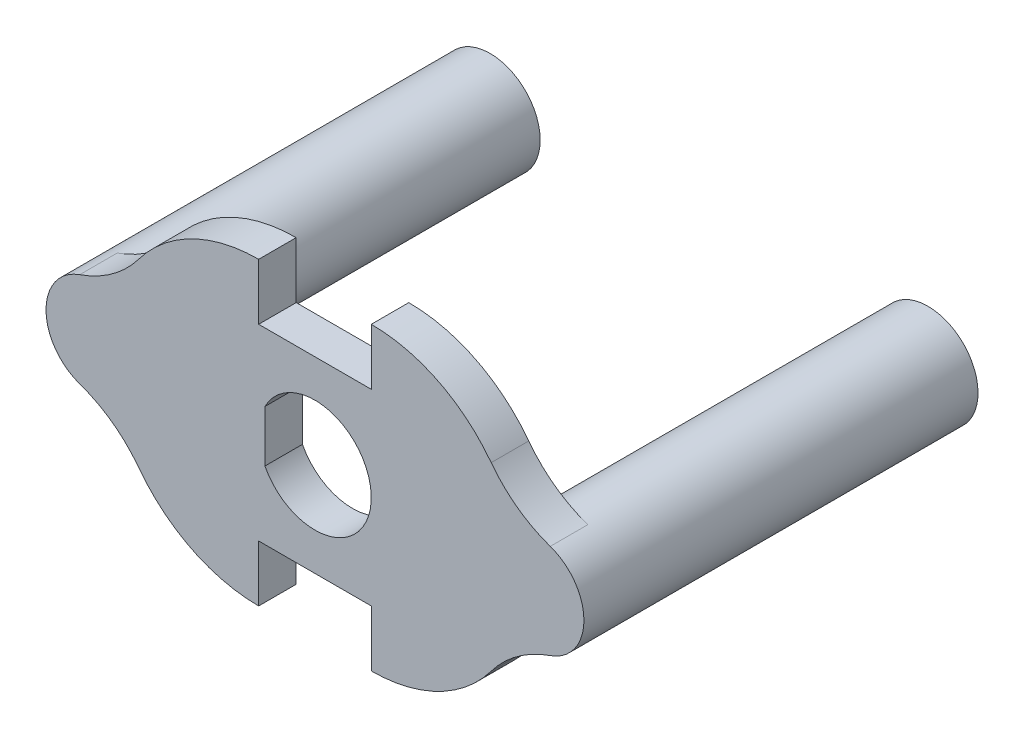
ISO-10303-21;
HEADER;
FILE_DESCRIPTION(('STEP AP214'),'2;1');
FILE_NAME('part.step','',(''),(''),'','','');
FILE_SCHEMA(('AUTOMOTIVE_DESIGN { 1 0 10303 214 1 1 1 1 }'));
ENDSEC;
DATA;
#1=APPLICATION_CONTEXT('core data for automotive mechanical design processes');
#2=APPLICATION_PROTOCOL_DEFINITION('international standard','automotive_design',2000,#1);
#3=PRODUCT_CONTEXT('',#1,'mechanical');
#4=PRODUCT('Part','Part','',(#3));
#5=PRODUCT_RELATED_PRODUCT_CATEGORY('part','',(#4));
#6=PRODUCT_DEFINITION_FORMATION('','',#4);
#7=PRODUCT_DEFINITION_CONTEXT('part definition',#1,'design');
#8=PRODUCT_DEFINITION('design','',#6,#7);
#9=PRODUCT_DEFINITION_SHAPE('','',#8);
#10=(LENGTH_UNIT() NAMED_UNIT(*) SI_UNIT(.MILLI.,.METRE.));
#11=(NAMED_UNIT(*) PLANE_ANGLE_UNIT() SI_UNIT($,.RADIAN.));
#12=(NAMED_UNIT(*) SI_UNIT($,.STERADIAN.) SOLID_ANGLE_UNIT());
#13=UNCERTAINTY_MEASURE_WITH_UNIT(LENGTH_MEASURE(1.E-05),#10,'distance_accuracy_value','');
#14=(GEOMETRIC_REPRESENTATION_CONTEXT(3) GLOBAL_UNCERTAINTY_ASSIGNED_CONTEXT((#13)) GLOBAL_UNIT_ASSIGNED_CONTEXT((#10,
#11,#12)) REPRESENTATION_CONTEXT('',''));
#15=CARTESIAN_POINT('',(0.,0.,0.));
#16=DIRECTION('',(0.,0.,1.));
#17=DIRECTION('',(1.,0.,0.));
#18=AXIS2_PLACEMENT_3D('',#15,#16,#17);
#19=CARTESIAN_POINT('',(-17.5,0.,-1.5));
#20=DIRECTION('',(0.,0.,1.));
#21=DIRECTION('',(1.,0.,0.));
#22=AXIS2_PLACEMENT_3D('',#19,#20,#21);
#23=CYLINDRICAL_SURFACE('',#22,4.);
#24=CARTESIAN_POINT('',(-17.5,0.,1.5));
#25=DIRECTION('',(0.,0.,1.));
#26=DIRECTION('',(-1.,0.,0.));
#27=AXIS2_PLACEMENT_3D('',#24,#25,#26);
#28=CIRCLE('',#27,4.);
#29=CARTESIAN_POINT('',(-18.8076923076923,3.78020380778634,1.5));
#30=VERTEX_POINT('',#29);
#31=CARTESIAN_POINT('',(-18.8076923076923,-3.78020380778634,1.5));
#32=VERTEX_POINT('',#31);
#33=EDGE_CURVE('E324',#30,#32,#28,.T.);
#34=ORIENTED_EDGE('',*,*,#33,.F.);
#35=DIRECTION('',(0.,0.,1.));
#36=VECTOR('',#35,1.);
#37=CARTESIAN_POINT('',(-18.8076923076923,3.78020380778634,-1.5));
#38=LINE('',#37,#36);
#39=CARTESIAN_POINT('',(-18.8076923076923,3.78020380778635,-1.5));
#40=VERTEX_POINT('',#39);
#41=EDGE_CURVE('E399',#40,#30,#38,.T.);
#42=ORIENTED_EDGE('',*,*,#41,.F.);
#43=CARTESIAN_POINT('',(-17.5,0.,-1.5));
#44=DIRECTION('',(0.,0.,-1.));
#45=DIRECTION('',(-1.,0.,0.));
#46=AXIS2_PLACEMENT_3D('',#43,#44,#45);
#47=CIRCLE('',#46,4.);
#48=CARTESIAN_POINT('',(-18.8076923076923,-3.78020380778634,-1.5));
#49=VERTEX_POINT('',#48);
#50=EDGE_CURVE('E11',#40,#49,#47,.T.);
#51=ORIENTED_EDGE('',*,*,#50,.T.);
#52=DIRECTION('',(0.,0.,1.));
#53=VECTOR('',#52,1.);
#54=CARTESIAN_POINT('',(-18.8076923076923,-3.78020380778634,-1.5));
#55=LINE('',#54,#53);
#56=EDGE_CURVE('E396',#49,#32,#55,.T.);
#57=ORIENTED_EDGE('',*,*,#56,.T.);
#58=EDGE_LOOP('',(#34,#42,#51,#57));
#59=FACE_BOUND('',#58,.T.);
#60=CARTESIAN_POINT('',(-17.5,0.,-30.));
#61=DIRECTION('',(0.,0.,1.));
#62=DIRECTION('',(1.,0.,0.));
#63=AXIS2_PLACEMENT_3D('',#60,#61,#62);
#64=CIRCLE('',#63,4.);
#65=CARTESIAN_POINT('',(-13.5,0.,-30.));
#66=VERTEX_POINT('',#65);
#67=EDGE_CURVE('E203',#66,#66,#64,.T.);
#68=ORIENTED_EDGE('',*,*,#67,.T.);
#69=EDGE_LOOP('',(#68));
#70=FACE_BOUND('',#69,.T.);
#71=DIRECTION('',(0.,0.,-1.));
#72=VECTOR('',#71,1.);
#73=CARTESIAN_POINT('',(-20.1457513110646,3.,-12.5));
#74=LINE('',#73,#72);
#75=CARTESIAN_POINT('',(-20.1457513110646,3.,-12.5));
#76=VERTEX_POINT('',#75);
#77=CARTESIAN_POINT('',(-20.1457513110646,3.,-18.5));
#78=VERTEX_POINT('',#77);
#79=EDGE_CURVE('E186',#76,#78,#74,.T.);
#80=ORIENTED_EDGE('',*,*,#79,.F.);
#81=CARTESIAN_POINT('',(-17.5,0.,-12.5));
#82=DIRECTION('',(0.,0.,-1.));
#83=DIRECTION('',(-1.,0.,0.));
#84=AXIS2_PLACEMENT_3D('',#81,#82,#83);
#85=CIRCLE('',#84,4.);
#86=CARTESIAN_POINT('',(-20.1457513110646,-3.,-12.5));
#87=VERTEX_POINT('',#86);
#88=EDGE_CURVE('E175',#87,#76,#85,.T.);
#89=ORIENTED_EDGE('',*,*,#88,.F.);
#90=DIRECTION('',(0.,0.,-1.));
#91=VECTOR('',#90,1.);
#92=CARTESIAN_POINT('',(-20.1457513110646,-3.,-12.5));
#93=LINE('',#92,#91);
#94=CARTESIAN_POINT('',(-20.1457513110646,-3.,-18.5));
#95=VERTEX_POINT('',#94);
#96=EDGE_CURVE('E188',#87,#95,#93,.T.);
#97=ORIENTED_EDGE('',*,*,#96,.T.);
#98=CARTESIAN_POINT('',(-17.5,0.,-18.5));
#99=DIRECTION('',(0.,0.,-1.));
#100=DIRECTION('',(-1.,0.,0.));
#101=AXIS2_PLACEMENT_3D('',#98,#99,#100);
#102=CIRCLE('',#101,4.);
#103=EDGE_CURVE('E191',#95,#78,#102,.T.);
#104=ORIENTED_EDGE('',*,*,#103,.T.);
#105=EDGE_LOOP('',(#80,#89,#97,#104));
#106=FACE_BOUND('',#105,.T.);
#107=ADVANCED_FACE('F38',(#59,#70,#106),#23,.T.);
#108=CARTESIAN_POINT('',(4.5,7.5,-1.5));
#109=DIRECTION('',(-1.,0.,0.));
#110=DIRECTION('',(0.,0.,1.));
#111=AXIS2_PLACEMENT_3D('',#108,#109,#110);
#112=PLANE('',#111);
#113=DIRECTION('',(0.,-1.,0.));
#114=VECTOR('',#113,1.);
#115=CARTESIAN_POINT('',(4.5,7.5,1.5));
#116=LINE('',#115,#114);
#117=CARTESIAN_POINT('',(4.5,12.,1.5));
#118=VERTEX_POINT('',#117);
#119=CARTESIAN_POINT('',(4.5,7.5,1.5));
#120=VERTEX_POINT('',#119);
#121=EDGE_CURVE('E243',#118,#120,#116,.T.);
#122=ORIENTED_EDGE('',*,*,#121,.F.);
#123=DIRECTION('',(0.,0.,1.));
#124=VECTOR('',#123,1.);
#125=CARTESIAN_POINT('',(4.5,12.,-1.5));
#126=LINE('',#125,#124);
#127=CARTESIAN_POINT('',(4.5,12.,-1.5));
#128=VERTEX_POINT('',#127);
#129=EDGE_CURVE('E226',#128,#118,#126,.T.);
#130=ORIENTED_EDGE('',*,*,#129,.F.);
#131=DIRECTION('',(0.,-1.,0.));
#132=VECTOR('',#131,1.);
#133=CARTESIAN_POINT('',(4.5,7.5,-1.5));
#134=LINE('',#133,#132);
#135=CARTESIAN_POINT('',(4.5,7.5,-1.5));
#136=VERTEX_POINT('',#135);
#137=EDGE_CURVE('E247',#128,#136,#134,.T.);
#138=ORIENTED_EDGE('',*,*,#137,.T.);
#139=DIRECTION('',(0.,0.,1.));
#140=VECTOR('',#139,1.);
#141=CARTESIAN_POINT('',(4.5,7.5,-1.5));
#142=LINE('',#141,#140);
#143=EDGE_CURVE('E304',#136,#120,#142,.T.);
#144=ORIENTED_EDGE('',*,*,#143,.T.);
#145=EDGE_LOOP('',(#122,#130,#138,#144));
#146=FACE_BOUND('',#145,.T.);
#147=ADVANCED_FACE('F40',(#146),#112,.T.);
#148=CARTESIAN_POINT('',(4.5,0.,-1.5));
#149=DIRECTION('',(0.,0.,1.));
#150=DIRECTION('',(1.,0.,0.));
#151=AXIS2_PLACEMENT_3D('',#148,#149,#150);
#152=CYLINDRICAL_SURFACE('',#151,12.);
#153=CARTESIAN_POINT('',(4.5,0.,1.5));
#154=DIRECTION('',(0.,0.,1.));
#155=DIRECTION('',(-1.,0.,0.));
#156=AXIS2_PLACEMENT_3D('',#153,#154,#155);
#157=CIRCLE('',#156,12.);
#158=CARTESIAN_POINT('',(14.0874125874126,7.21675272395575,1.5));
#159=VERTEX_POINT('',#158);
#160=EDGE_CURVE('E252',#159,#118,#157,.T.);
#161=ORIENTED_EDGE('',*,*,#160,.F.);
#162=DIRECTION('',(0.,0.,1.));
#163=VECTOR('',#162,1.);
#164=CARTESIAN_POINT('',(14.0874125874126,7.21675272395575,-1.5));
#165=LINE('',#164,#163);
#166=CARTESIAN_POINT('',(14.0874125874126,7.21675272395575,-1.5));
#167=VERTEX_POINT('',#166);
#168=EDGE_CURVE('E369',#167,#159,#165,.T.);
#169=ORIENTED_EDGE('',*,*,#168,.F.);
#170=CARTESIAN_POINT('',(4.5,0.,-1.5));
#171=DIRECTION('',(0.,0.,1.));
#172=DIRECTION('',(-1.,0.,0.));
#173=AXIS2_PLACEMENT_3D('',#170,#171,#172);
#174=CIRCLE('',#173,12.);
#175=EDGE_CURVE('E300',#167,#128,#174,.T.);
#176=ORIENTED_EDGE('',*,*,#175,.T.);
#177=ORIENTED_EDGE('',*,*,#129,.T.);
#178=EDGE_LOOP('',(#161,#169,#176,#177));
#179=FACE_BOUND('',#178,.T.);
#180=ADVANCED_FACE('F424',(#179),#152,.T.);
#181=CARTESIAN_POINT('',(22.0769230769231,13.2307133272522,-1.5));
#182=DIRECTION('',(0.,0.,1.));
#183=DIRECTION('',(1.,0.,0.));
#184=AXIS2_PLACEMENT_3D('',#181,#182,#183);
#185=CYLINDRICAL_SURFACE('',#184,10.);
#186=CARTESIAN_POINT('',(22.0769230769231,13.2307133272522,1.5));
#187=DIRECTION('',(0.,0.,-1.));
#188=DIRECTION('',(1.,0.,0.));
#189=AXIS2_PLACEMENT_3D('',#186,#187,#188);
#190=CIRCLE('',#189,10.);
#191=CARTESIAN_POINT('',(18.8076923076923,3.78020380778634,1.5));
#192=VERTEX_POINT('',#191);
#193=EDGE_CURVE('E360',#192,#159,#190,.T.);
#194=ORIENTED_EDGE('',*,*,#193,.F.);
#195=DIRECTION('',(0.,0.,1.));
#196=VECTOR('',#195,1.);
#197=CARTESIAN_POINT('',(18.8076923076923,3.78020380778634,-1.5));
#198=LINE('',#197,#196);
#199=CARTESIAN_POINT('',(18.8076923076923,3.78020380778634,-1.5));
#200=VERTEX_POINT('',#199);
#201=EDGE_CURVE('E372',#200,#192,#198,.T.);
#202=ORIENTED_EDGE('',*,*,#201,.F.);
#203=CARTESIAN_POINT('',(22.0769230769231,13.2307133272522,-1.5));
#204=DIRECTION('',(0.,0.,-1.));
#205=DIRECTION('',(1.,0.,0.));
#206=AXIS2_PLACEMENT_3D('',#203,#204,#205);
#207=CIRCLE('',#206,10.);
#208=EDGE_CURVE('E296',#200,#167,#207,.T.);
#209=ORIENTED_EDGE('',*,*,#208,.T.);
#210=ORIENTED_EDGE('',*,*,#168,.T.);
#211=EDGE_LOOP('',(#194,#202,#209,#210));
#212=FACE_BOUND('',#211,.T.);
#213=ADVANCED_FACE('F480',(#212),#185,.F.);
#214=CARTESIAN_POINT('',(17.5,0.,-1.5));
#215=DIRECTION('',(0.,0.,1.));
#216=DIRECTION('',(1.,0.,0.));
#217=AXIS2_PLACEMENT_3D('',#214,#215,#216);
#218=CYLINDRICAL_SURFACE('',#217,4.);
#219=CARTESIAN_POINT('',(17.5,0.,1.5));
#220=DIRECTION('',(0.,0.,1.));
#221=DIRECTION('',(1.,0.,0.));
#222=AXIS2_PLACEMENT_3D('',#219,#220,#221);
#223=CIRCLE('',#222,4.);
#224=CARTESIAN_POINT('',(18.8076923076923,-3.78020380778635,1.5));
#225=VERTEX_POINT('',#224);
#226=EDGE_CURVE('E356',#225,#192,#223,.T.);
#227=ORIENTED_EDGE('',*,*,#226,.F.);
#228=DIRECTION('',(0.,0.,1.));
#229=VECTOR('',#228,1.);
#230=CARTESIAN_POINT('',(18.8076923076923,-3.78020380778635,-1.5));
#231=LINE('',#230,#229);
#232=CARTESIAN_POINT('',(18.8076923076923,-3.78020380778635,-1.5));
#233=VERTEX_POINT('',#232);
#234=EDGE_CURVE('E375',#233,#225,#231,.T.);
#235=ORIENTED_EDGE('',*,*,#234,.F.);
#236=CARTESIAN_POINT('',(17.5,0.,-1.5));
#237=DIRECTION('',(0.,0.,-1.));
#238=DIRECTION('',(-1.,0.,0.));
#239=AXIS2_PLACEMENT_3D('',#236,#237,#238);
#240=CIRCLE('',#239,4.);
#241=EDGE_CURVE('E47',#233,#200,#240,.T.);
#242=ORIENTED_EDGE('',*,*,#241,.T.);
#243=ORIENTED_EDGE('',*,*,#201,.T.);
#244=EDGE_LOOP('',(#227,#235,#242,#243));
#245=FACE_BOUND('',#244,.T.);
#246=CARTESIAN_POINT('',(17.5,0.,-30.));
#247=DIRECTION('',(0.,0.,-1.));
#248=DIRECTION('',(-1.,0.,0.));
#249=AXIS2_PLACEMENT_3D('',#246,#247,#248);
#250=CIRCLE('',#249,4.);
#251=CARTESIAN_POINT('',(13.5,0.,-30.));
#252=VERTEX_POINT('',#251);
#253=EDGE_CURVE('E215',#252,#252,#250,.T.);
#254=ORIENTED_EDGE('',*,*,#253,.F.);
#255=EDGE_LOOP('',(#254));
#256=FACE_BOUND('',#255,.T.);
#257=ADVANCED_FACE('F476',(#245,#256),#218,.T.);
#258=CARTESIAN_POINT('',(22.0769230769231,-13.2307133272522,-1.5));
#259=DIRECTION('',(0.,0.,1.));
#260=DIRECTION('',(1.,0.,0.));
#261=AXIS2_PLACEMENT_3D('',#258,#259,#260);
#262=CYLINDRICAL_SURFACE('',#261,10.);
#263=CARTESIAN_POINT('',(22.0769230769231,-13.2307133272522,1.5));
#264=DIRECTION('',(0.,0.,-1.));
#265=DIRECTION('',(-1.,0.,0.));
#266=AXIS2_PLACEMENT_3D('',#263,#264,#265);
#267=CIRCLE('',#266,10.);
#268=CARTESIAN_POINT('',(14.0874125874126,-7.21675272395575,1.5));
#269=VERTEX_POINT('',#268);
#270=EDGE_CURVE('E352',#269,#225,#267,.T.);
#271=ORIENTED_EDGE('',*,*,#270,.F.);
#272=DIRECTION('',(0.,0.,1.));
#273=VECTOR('',#272,1.);
#274=CARTESIAN_POINT('',(14.0874125874126,-7.21675272395575,-1.5));
#275=LINE('',#274,#273);
#276=CARTESIAN_POINT('',(14.0874125874126,-7.21675272395575,-1.5));
#277=VERTEX_POINT('',#276);
#278=EDGE_CURVE('E378',#277,#269,#275,.T.);
#279=ORIENTED_EDGE('',*,*,#278,.F.);
#280=CARTESIAN_POINT('',(22.0769230769231,-13.2307133272522,-1.5));
#281=DIRECTION('',(0.,0.,-1.));
#282=DIRECTION('',(-1.,0.,0.));
#283=AXIS2_PLACEMENT_3D('',#280,#281,#282);
#284=CIRCLE('',#283,10.);
#285=EDGE_CURVE('E292',#277,#233,#284,.T.);
#286=ORIENTED_EDGE('',*,*,#285,.T.);
#287=ORIENTED_EDGE('',*,*,#234,.T.);
#288=EDGE_LOOP('',(#271,#279,#286,#287));
#289=FACE_BOUND('',#288,.T.);
#290=ADVANCED_FACE('F472',(#289),#262,.F.);
#291=CARTESIAN_POINT('',(4.5,0.,-1.5));
#292=DIRECTION('',(0.,0.,1.));
#293=DIRECTION('',(1.,0.,0.));
#294=AXIS2_PLACEMENT_3D('',#291,#292,#293);
#295=CYLINDRICAL_SURFACE('',#294,12.);
#296=CARTESIAN_POINT('',(4.5,0.,1.5));
#297=DIRECTION('',(0.,0.,1.));
#298=DIRECTION('',(1.,0.,0.));
#299=AXIS2_PLACEMENT_3D('',#296,#297,#298);
#300=CIRCLE('',#299,12.);
#301=CARTESIAN_POINT('',(4.5,-12.,1.5));
#302=VERTEX_POINT('',#301);
#303=EDGE_CURVE('E348',#302,#269,#300,.T.);
#304=ORIENTED_EDGE('',*,*,#303,.F.);
#305=DIRECTION('',(0.,0.,1.));
#306=VECTOR('',#305,1.);
#307=CARTESIAN_POINT('',(4.5,-12.,-1.5));
#308=LINE('',#307,#306);
#309=CARTESIAN_POINT('',(4.5,-12.,-1.5));
#310=VERTEX_POINT('',#309);
#311=EDGE_CURVE('E381',#310,#302,#308,.T.);
#312=ORIENTED_EDGE('',*,*,#311,.F.);
#313=CARTESIAN_POINT('',(4.5,0.,-1.5));
#314=DIRECTION('',(0.,0.,1.));
#315=DIRECTION('',(1.,0.,0.));
#316=AXIS2_PLACEMENT_3D('',#313,#314,#315);
#317=CIRCLE('',#316,12.);
#318=EDGE_CURVE('E288',#310,#277,#317,.T.);
#319=ORIENTED_EDGE('',*,*,#318,.T.);
#320=ORIENTED_EDGE('',*,*,#278,.T.);
#321=EDGE_LOOP('',(#304,#312,#319,#320));
#322=FACE_BOUND('',#321,.T.);
#323=ADVANCED_FACE('F468',(#322),#295,.T.);
#324=CARTESIAN_POINT('',(4.5,-7.5,-1.5));
#325=DIRECTION('',(-1.,0.,0.));
#326=DIRECTION('',(0.,0.,1.));
#327=AXIS2_PLACEMENT_3D('',#324,#325,#326);
#328=PLANE('',#327);
#329=DIRECTION('',(0.,-1.,0.));
#330=VECTOR('',#329,1.);
#331=CARTESIAN_POINT('',(4.5,-7.5,1.5));
#332=LINE('',#331,#330);
#333=CARTESIAN_POINT('',(4.5,-7.5,1.5));
#334=VERTEX_POINT('',#333);
#335=EDGE_CURVE('E344',#334,#302,#332,.T.);
#336=ORIENTED_EDGE('',*,*,#335,.F.);
#337=DIRECTION('',(0.,0.,1.));
#338=VECTOR('',#337,1.);
#339=CARTESIAN_POINT('',(4.5,-7.5,-1.5));
#340=LINE('',#339,#338);
#341=CARTESIAN_POINT('',(4.5,-7.5,-1.5));
#342=VERTEX_POINT('',#341);
#343=EDGE_CURVE('E384',#342,#334,#340,.T.);
#344=ORIENTED_EDGE('',*,*,#343,.F.);
#345=DIRECTION('',(0.,-1.,0.));
#346=VECTOR('',#345,1.);
#347=CARTESIAN_POINT('',(4.5,-7.5,-1.5));
#348=LINE('',#347,#346);
#349=EDGE_CURVE('E284',#342,#310,#348,.T.);
#350=ORIENTED_EDGE('',*,*,#349,.T.);
#351=ORIENTED_EDGE('',*,*,#311,.T.);
#352=EDGE_LOOP('',(#336,#344,#350,#351));
#353=FACE_BOUND('',#352,.T.);
#354=ADVANCED_FACE('F464',(#353),#328,.T.);
#355=CARTESIAN_POINT('',(-4.5,-7.5,-1.5));
#356=DIRECTION('',(0.,-1.,0.));
#357=DIRECTION('',(0.,0.,-1.));
#358=AXIS2_PLACEMENT_3D('',#355,#356,#357);
#359=PLANE('',#358);
#360=DIRECTION('',(1.,0.,0.));
#361=VECTOR('',#360,1.);
#362=CARTESIAN_POINT('',(-4.5,-7.5,1.5));
#363=LINE('',#362,#361);
#364=CARTESIAN_POINT('',(-4.5,-7.5,1.5));
#365=VERTEX_POINT('',#364);
#366=EDGE_CURVE('E340',#365,#334,#363,.T.);
#367=ORIENTED_EDGE('',*,*,#366,.F.);
#368=DIRECTION('',(0.,0.,1.));
#369=VECTOR('',#368,1.);
#370=CARTESIAN_POINT('',(-4.5,-7.5,-1.5));
#371=LINE('',#370,#369);
#372=CARTESIAN_POINT('',(-4.5,-7.5,-1.5));
#373=VERTEX_POINT('',#372);
#374=EDGE_CURVE('E387',#373,#365,#371,.T.);
#375=ORIENTED_EDGE('',*,*,#374,.F.);
#376=DIRECTION('',(1.,0.,0.));
#377=VECTOR('',#376,1.);
#378=CARTESIAN_POINT('',(-4.5,-7.5,-1.5));
#379=LINE('',#378,#377);
#380=EDGE_CURVE('E280',#373,#342,#379,.T.);
#381=ORIENTED_EDGE('',*,*,#380,.T.);
#382=ORIENTED_EDGE('',*,*,#343,.T.);
#383=EDGE_LOOP('',(#367,#375,#381,#382));
#384=FACE_BOUND('',#383,.T.);
#385=ADVANCED_FACE('F460',(#384),#359,.T.);
#386=CARTESIAN_POINT('',(-4.5,-7.5,-1.5));
#387=DIRECTION('',(1.,0.,0.));
#388=DIRECTION('',(0.,0.,-1.));
#389=AXIS2_PLACEMENT_3D('',#386,#387,#388);
#390=PLANE('',#389);
#391=DIRECTION('',(0.,1.,0.));
#392=VECTOR('',#391,1.);
#393=CARTESIAN_POINT('',(-4.5,-7.5,1.5));
#394=LINE('',#393,#392);
#395=CARTESIAN_POINT('',(-4.5,-12.,1.5));
#396=VERTEX_POINT('',#395);
#397=EDGE_CURVE('E336',#396,#365,#394,.T.);
#398=ORIENTED_EDGE('',*,*,#397,.F.);
#399=DIRECTION('',(0.,0.,1.));
#400=VECTOR('',#399,1.);
#401=CARTESIAN_POINT('',(-4.5,-12.,-1.5));
#402=LINE('',#401,#400);
#403=CARTESIAN_POINT('',(-4.5,-12.,-1.5));
#404=VERTEX_POINT('',#403);
#405=EDGE_CURVE('E390',#404,#396,#402,.T.);
#406=ORIENTED_EDGE('',*,*,#405,.F.);
#407=DIRECTION('',(0.,1.,0.));
#408=VECTOR('',#407,1.);
#409=CARTESIAN_POINT('',(-4.5,-7.5,-1.5));
#410=LINE('',#409,#408);
#411=EDGE_CURVE('E276',#404,#373,#410,.T.);
#412=ORIENTED_EDGE('',*,*,#411,.T.);
#413=ORIENTED_EDGE('',*,*,#374,.T.);
#414=EDGE_LOOP('',(#398,#406,#412,#413));
#415=FACE_BOUND('',#414,.T.);
#416=ADVANCED_FACE('F456',(#415),#390,.T.);
#417=CARTESIAN_POINT('',(-4.5,0.,-1.5));
#418=DIRECTION('',(0.,0.,1.));
#419=DIRECTION('',(1.,0.,0.));
#420=AXIS2_PLACEMENT_3D('',#417,#418,#419);
#421=CYLINDRICAL_SURFACE('',#420,12.);
#422=CARTESIAN_POINT('',(-4.5,0.,1.5));
#423=DIRECTION('',(0.,0.,1.));
#424=DIRECTION('',(-1.,0.,0.));
#425=AXIS2_PLACEMENT_3D('',#422,#423,#424);
#426=CIRCLE('',#425,12.);
#427=CARTESIAN_POINT('',(-14.0874125874126,-7.21675272395575,1.5));
#428=VERTEX_POINT('',#427);
#429=EDGE_CURVE('E332',#428,#396,#426,.T.);
#430=ORIENTED_EDGE('',*,*,#429,.F.);
#431=DIRECTION('',(0.,0.,1.));
#432=VECTOR('',#431,1.);
#433=CARTESIAN_POINT('',(-14.0874125874126,-7.21675272395575,-1.5));
#434=LINE('',#433,#432);
#435=CARTESIAN_POINT('',(-14.0874125874126,-7.21675272395575,-1.5));
#436=VERTEX_POINT('',#435);
#437=EDGE_CURVE('E393',#436,#428,#434,.T.);
#438=ORIENTED_EDGE('',*,*,#437,.F.);
#439=CARTESIAN_POINT('',(-4.5,0.,-1.5));
#440=DIRECTION('',(0.,0.,1.));
#441=DIRECTION('',(-1.,0.,0.));
#442=AXIS2_PLACEMENT_3D('',#439,#440,#441);
#443=CIRCLE('',#442,12.);
#444=EDGE_CURVE('E272',#436,#404,#443,.T.);
#445=ORIENTED_EDGE('',*,*,#444,.T.);
#446=ORIENTED_EDGE('',*,*,#405,.T.);
#447=EDGE_LOOP('',(#430,#438,#445,#446));
#448=FACE_BOUND('',#447,.T.);
#449=ADVANCED_FACE('F452',(#448),#421,.T.);
#450=CARTESIAN_POINT('',(-22.0769230769231,-13.2307133272522,-1.5));
#451=DIRECTION('',(0.,0.,1.));
#452=DIRECTION('',(1.,0.,0.));
#453=AXIS2_PLACEMENT_3D('',#450,#451,#452);
#454=CYLINDRICAL_SURFACE('',#453,10.);
#455=CARTESIAN_POINT('',(-22.0769230769231,-13.2307133272522,1.5));
#456=DIRECTION('',(0.,0.,-1.));
#457=DIRECTION('',(1.,0.,0.));
#458=AXIS2_PLACEMENT_3D('',#455,#456,#457);
#459=CIRCLE('',#458,10.);
#460=EDGE_CURVE('E328',#32,#428,#459,.T.);
#461=ORIENTED_EDGE('',*,*,#460,.F.);
#462=ORIENTED_EDGE('',*,*,#56,.F.);
#463=CARTESIAN_POINT('',(-22.0769230769231,-13.2307133272522,-1.5));
#464=DIRECTION('',(0.,0.,-1.));
#465=DIRECTION('',(1.,0.,0.));
#466=AXIS2_PLACEMENT_3D('',#463,#464,#465);
#467=CIRCLE('',#466,10.);
#468=EDGE_CURVE('E268',#49,#436,#467,.T.);
#469=ORIENTED_EDGE('',*,*,#468,.T.);
#470=ORIENTED_EDGE('',*,*,#437,.T.);
#471=EDGE_LOOP('',(#461,#462,#469,#470));
#472=FACE_BOUND('',#471,.T.);
#473=ADVANCED_FACE('F448',(#472),#454,.F.);
#474=CARTESIAN_POINT('',(-22.0769230769231,13.2307133272522,-1.5));
#475=DIRECTION('',(0.,0.,1.));
#476=DIRECTION('',(1.,0.,0.));
#477=AXIS2_PLACEMENT_3D('',#474,#475,#476);
#478=CYLINDRICAL_SURFACE('',#477,10.);
#479=CARTESIAN_POINT('',(-22.0769230769231,13.2307133272522,1.5));
#480=DIRECTION('',(0.,0.,-1.));
#481=DIRECTION('',(-1.,0.,0.));
#482=AXIS2_PLACEMENT_3D('',#479,#480,#481);
#483=CIRCLE('',#482,10.);
#484=CARTESIAN_POINT('',(-14.0874125874126,7.21675272395575,1.5));
#485=VERTEX_POINT('',#484);
#486=EDGE_CURVE('E320',#485,#30,#483,.T.);
#487=ORIENTED_EDGE('',*,*,#486,.F.);
#488=DIRECTION('',(0.,0.,1.));
#489=VECTOR('',#488,1.);
#490=CARTESIAN_POINT('',(-14.0874125874126,7.21675272395575,-1.5));
#491=LINE('',#490,#489);
#492=CARTESIAN_POINT('',(-14.0874125874126,7.21675272395575,-1.5));
#493=VERTEX_POINT('',#492);
#494=EDGE_CURVE('E402',#493,#485,#491,.T.);
#495=ORIENTED_EDGE('',*,*,#494,.F.);
#496=CARTESIAN_POINT('',(-22.0769230769231,13.2307133272522,-1.5));
#497=DIRECTION('',(0.,0.,-1.));
#498=DIRECTION('',(-1.,0.,0.));
#499=AXIS2_PLACEMENT_3D('',#496,#497,#498);
#500=CIRCLE('',#499,10.);
#501=EDGE_CURVE('E264',#493,#40,#500,.T.);
#502=ORIENTED_EDGE('',*,*,#501,.T.);
#503=ORIENTED_EDGE('',*,*,#41,.T.);
#504=EDGE_LOOP('',(#487,#495,#502,#503));
#505=FACE_BOUND('',#504,.T.);
#506=ADVANCED_FACE('F439',(#505),#478,.F.);
#507=CARTESIAN_POINT('',(-4.5,0.,-1.5));
#508=DIRECTION('',(0.,0.,1.));
#509=DIRECTION('',(1.,0.,0.));
#510=AXIS2_PLACEMENT_3D('',#507,#508,#509);
#511=CYLINDRICAL_SURFACE('',#510,12.);
#512=CARTESIAN_POINT('',(-4.5,0.,1.5));
#513=DIRECTION('',(0.,0.,1.));
#514=DIRECTION('',(1.,0.,0.));
#515=AXIS2_PLACEMENT_3D('',#512,#513,#514);
#516=CIRCLE('',#515,12.);
#517=CARTESIAN_POINT('',(-4.5,12.,1.5));
#518=VERTEX_POINT('',#517);
#519=EDGE_CURVE('E316',#518,#485,#516,.T.);
#520=ORIENTED_EDGE('',*,*,#519,.F.);
#521=DIRECTION('',(0.,0.,1.));
#522=VECTOR('',#521,1.);
#523=CARTESIAN_POINT('',(-4.5,12.,-1.5));
#524=LINE('',#523,#522);
#525=CARTESIAN_POINT('',(-4.5,12.,-1.5));
#526=VERTEX_POINT('',#525);
#527=EDGE_CURVE('E405',#526,#518,#524,.T.);
#528=ORIENTED_EDGE('',*,*,#527,.F.);
#529=CARTESIAN_POINT('',(-4.5,0.,-1.5));
#530=DIRECTION('',(0.,0.,1.));
#531=DIRECTION('',(1.,0.,0.));
#532=AXIS2_PLACEMENT_3D('',#529,#530,#531);
#533=CIRCLE('',#532,12.);
#534=EDGE_CURVE('E260',#526,#493,#533,.T.);
#535=ORIENTED_EDGE('',*,*,#534,.T.);
#536=ORIENTED_EDGE('',*,*,#494,.T.);
#537=EDGE_LOOP('',(#520,#528,#535,#536));
#538=FACE_BOUND('',#537,.T.);
#539=ADVANCED_FACE('F437',(#538),#511,.T.);
#540=CARTESIAN_POINT('',(-4.5,7.5,-1.5));
#541=DIRECTION('',(1.,0.,0.));
#542=DIRECTION('',(0.,0.,-1.));
#543=AXIS2_PLACEMENT_3D('',#540,#541,#542);
#544=PLANE('',#543);
#545=DIRECTION('',(0.,1.,0.));
#546=VECTOR('',#545,1.);
#547=CARTESIAN_POINT('',(-4.5,7.5,1.5));
#548=LINE('',#547,#546);
#549=CARTESIAN_POINT('',(-4.5,7.5,1.5));
#550=VERTEX_POINT('',#549);
#551=EDGE_CURVE('E312',#550,#518,#548,.T.);
#552=ORIENTED_EDGE('',*,*,#551,.F.);
#553=DIRECTION('',(0.,0.,1.));
#554=VECTOR('',#553,1.);
#555=CARTESIAN_POINT('',(-4.5,7.5,-1.5));
#556=LINE('',#555,#554);
#557=CARTESIAN_POINT('',(-4.5,7.5,-1.5));
#558=VERTEX_POINT('',#557);
#559=EDGE_CURVE('E408',#558,#550,#556,.T.);
#560=ORIENTED_EDGE('',*,*,#559,.F.);
#561=DIRECTION('',(0.,1.,0.));
#562=VECTOR('',#561,1.);
#563=CARTESIAN_POINT('',(-4.5,7.5,-1.5));
#564=LINE('',#563,#562);
#565=EDGE_CURVE('E256',#558,#526,#564,.T.);
#566=ORIENTED_EDGE('',*,*,#565,.T.);
#567=ORIENTED_EDGE('',*,*,#527,.T.);
#568=EDGE_LOOP('',(#552,#560,#566,#567));
#569=FACE_BOUND('',#568,.T.);
#570=ADVANCED_FACE('F433',(#569),#544,.T.);
#571=CARTESIAN_POINT('',(-4.5,7.5,-1.5));
#572=DIRECTION('',(0.,1.,0.));
#573=DIRECTION('',(0.,0.,1.));
#574=AXIS2_PLACEMENT_3D('',#571,#572,#573);
#575=PLANE('',#574);
#576=DIRECTION('',(-1.,0.,0.));
#577=VECTOR('',#576,1.);
#578=CARTESIAN_POINT('',(-4.5,7.5,1.5));
#579=LINE('',#578,#577);
#580=EDGE_CURVE('E308',#120,#550,#579,.T.);
#581=ORIENTED_EDGE('',*,*,#580,.F.);
#582=ORIENTED_EDGE('',*,*,#143,.F.);
#583=DIRECTION('',(-1.,0.,0.));
#584=VECTOR('',#583,1.);
#585=CARTESIAN_POINT('',(-4.5,7.5,-1.5));
#586=LINE('',#585,#584);
#587=EDGE_CURVE('E251',#136,#558,#586,.T.);
#588=ORIENTED_EDGE('',*,*,#587,.T.);
#589=ORIENTED_EDGE('',*,*,#559,.T.);
#590=EDGE_LOOP('',(#581,#582,#588,#589));
#591=FACE_BOUND('',#590,.T.);
#592=ADVANCED_FACE('F417',(#591),#575,.T.);
#593=CARTESIAN_POINT('',(4.5,0.,-1.5));
#594=DIRECTION('',(0.,0.,-1.));
#595=DIRECTION('',(-1.,0.,0.));
#596=AXIS2_PLACEMENT_3D('',#593,#594,#595);
#597=PLANE('',#596);
#598=ORIENTED_EDGE('',*,*,#50,.F.);
#599=ORIENTED_EDGE('',*,*,#501,.F.);
#600=ORIENTED_EDGE('',*,*,#534,.F.);
#601=ORIENTED_EDGE('',*,*,#565,.F.);
#602=ORIENTED_EDGE('',*,*,#587,.F.);
#603=ORIENTED_EDGE('',*,*,#137,.F.);
#604=ORIENTED_EDGE('',*,*,#175,.F.);
#605=ORIENTED_EDGE('',*,*,#208,.F.);
#606=ORIENTED_EDGE('',*,*,#241,.F.);
#607=ORIENTED_EDGE('',*,*,#285,.F.);
#608=ORIENTED_EDGE('',*,*,#318,.F.);
#609=ORIENTED_EDGE('',*,*,#349,.F.);
#610=ORIENTED_EDGE('',*,*,#380,.F.);
#611=ORIENTED_EDGE('',*,*,#411,.F.);
#612=ORIENTED_EDGE('',*,*,#444,.F.);
#613=ORIENTED_EDGE('',*,*,#468,.F.);
#614=EDGE_LOOP('',(#598,#599,#600,#601,#602,#603,#604,#605,#606,#607,#608,#609,#610,#611,#612,#613));
#615=FACE_BOUND('',#614,.T.);
#616=CARTESIAN_POINT('',(0.,0.,-1.5));
#617=DIRECTION('',(0.,0.,1.));
#618=DIRECTION('',(1.,0.,0.));
#619=AXIS2_PLACEMENT_3D('',#616,#617,#618);
#620=CIRCLE('',#619,4.5);
#621=CARTESIAN_POINT('',(-4.,-2.06155281280883,-1.5));
#622=VERTEX_POINT('',#621);
#623=CARTESIAN_POINT('',(-4.,2.06155281280883,-1.5));
#624=VERTEX_POINT('',#623);
#625=EDGE_CURVE('E61',#622,#624,#620,.T.);
#626=ORIENTED_EDGE('',*,*,#625,.T.);
#627=DIRECTION('',(0.,-1.,0.));
#628=VECTOR('',#627,1.);
#629=CARTESIAN_POINT('',(-4.,2.06155281280883,-1.5));
#630=LINE('',#629,#628);
#631=EDGE_CURVE('E229',#624,#622,#630,.T.);
#632=ORIENTED_EDGE('',*,*,#631,.T.);
#633=EDGE_LOOP('',(#626,#632));
#634=FACE_BOUND('',#633,.T.);
#635=ADVANCED_FACE('F427',(#615,#634),#597,.T.);
#636=CARTESIAN_POINT('',(4.5,0.,1.5));
#637=DIRECTION('',(0.,0.,-1.));
#638=DIRECTION('',(-1.,0.,0.));
#639=AXIS2_PLACEMENT_3D('',#636,#637,#638);
#640=PLANE('',#639);
#641=DIRECTION('',(0.,-1.,0.));
#642=VECTOR('',#641,1.);
#643=CARTESIAN_POINT('',(-4.,2.06155281280883,1.5));
#644=LINE('',#643,#642);
#645=CARTESIAN_POINT('',(-4.,2.06155281280883,1.5));
#646=VERTEX_POINT('',#645);
#647=CARTESIAN_POINT('',(-4.,-2.06155281280883,1.5));
#648=VERTEX_POINT('',#647);
#649=EDGE_CURVE('E230',#646,#648,#644,.T.);
#650=ORIENTED_EDGE('',*,*,#649,.F.);
#651=CARTESIAN_POINT('',(0.,0.,1.5));
#652=DIRECTION('',(0.,0.,1.));
#653=DIRECTION('',(1.,0.,0.));
#654=AXIS2_PLACEMENT_3D('',#651,#652,#653);
#655=CIRCLE('',#654,4.5);
#656=EDGE_CURVE('E222',#648,#646,#655,.T.);
#657=ORIENTED_EDGE('',*,*,#656,.F.);
#658=EDGE_LOOP('',(#650,#657));
#659=FACE_BOUND('',#658,.T.);
#660=ORIENTED_EDGE('',*,*,#121,.T.);
#661=ORIENTED_EDGE('',*,*,#580,.T.);
#662=ORIENTED_EDGE('',*,*,#551,.T.);
#663=ORIENTED_EDGE('',*,*,#519,.T.);
#664=ORIENTED_EDGE('',*,*,#486,.T.);
#665=ORIENTED_EDGE('',*,*,#33,.T.);
#666=ORIENTED_EDGE('',*,*,#460,.T.);
#667=ORIENTED_EDGE('',*,*,#429,.T.);
#668=ORIENTED_EDGE('',*,*,#397,.T.);
#669=ORIENTED_EDGE('',*,*,#366,.T.);
#670=ORIENTED_EDGE('',*,*,#335,.T.);
#671=ORIENTED_EDGE('',*,*,#303,.T.);
#672=ORIENTED_EDGE('',*,*,#270,.T.);
#673=ORIENTED_EDGE('',*,*,#226,.T.);
#674=ORIENTED_EDGE('',*,*,#193,.T.);
#675=ORIENTED_EDGE('',*,*,#160,.T.);
#676=EDGE_LOOP('',(#660,#661,#662,#663,#664,#665,#666,#667,#668,#669,#670,#671,#672,#673,#674,#675));
#677=FACE_BOUND('',#676,.T.);
#678=ADVANCED_FACE('F420',(#659,#677),#640,.F.);
#679=CARTESIAN_POINT('',(0.,0.,-1.5));
#680=DIRECTION('',(0.,0.,1.));
#681=DIRECTION('',(1.,0.,0.));
#682=AXIS2_PLACEMENT_3D('',#679,#680,#681);
#683=CYLINDRICAL_SURFACE('',#682,4.5);
#684=ORIENTED_EDGE('',*,*,#656,.T.);
#685=DIRECTION('',(0.,0.,1.));
#686=VECTOR('',#685,1.);
#687=CARTESIAN_POINT('',(-4.,2.06155281280883,-1.5));
#688=LINE('',#687,#686);
#689=EDGE_CURVE('E234',#624,#646,#688,.T.);
#690=ORIENTED_EDGE('',*,*,#689,.F.);
#691=ORIENTED_EDGE('',*,*,#625,.F.);
#692=DIRECTION('',(0.,0.,1.));
#693=VECTOR('',#692,1.);
#694=CARTESIAN_POINT('',(-4.,-2.06155281280883,-1.5));
#695=LINE('',#694,#693);
#696=EDGE_CURVE('E240',#622,#648,#695,.T.);
#697=ORIENTED_EDGE('',*,*,#696,.T.);
#698=EDGE_LOOP('',(#684,#690,#691,#697));
#699=FACE_BOUND('',#698,.T.);
#700=ADVANCED_FACE('F512',(#699),#683,.F.);
#701=CARTESIAN_POINT('',(-4.,2.06155281280883,-1.5));
#702=DIRECTION('',(-1.,0.,0.));
#703=DIRECTION('',(0.,0.,1.));
#704=AXIS2_PLACEMENT_3D('',#701,#702,#703);
#705=PLANE('',#704);
#706=ORIENTED_EDGE('',*,*,#649,.T.);
#707=ORIENTED_EDGE('',*,*,#696,.F.);
#708=ORIENTED_EDGE('',*,*,#631,.F.);
#709=ORIENTED_EDGE('',*,*,#689,.T.);
#710=EDGE_LOOP('',(#706,#707,#708,#709));
#711=FACE_BOUND('',#710,.T.);
#712=ADVANCED_FACE('F518',(#711),#705,.F.);
#713=CARTESIAN_POINT('',(17.5,0.,-30.));
#714=DIRECTION('',(0.,0.,-1.));
#715=DIRECTION('',(-1.,0.,0.));
#716=AXIS2_PLACEMENT_3D('',#713,#714,#715);
#717=PLANE('',#716);
#718=CARTESIAN_POINT('',(17.5,0.,-30.));
#719=DIRECTION('',(0.,0.,-1.));
#720=DIRECTION('',(-1.,0.,0.));
#721=AXIS2_PLACEMENT_3D('',#718,#719,#720);
#722=CIRCLE('',#721,1.5);
#723=CARTESIAN_POINT('',(16.,0.,-30.));
#724=VERTEX_POINT('',#723);
#725=EDGE_CURVE('E210',#724,#724,#722,.T.);
#726=ORIENTED_EDGE('',*,*,#725,.F.);
#727=EDGE_LOOP('',(#726));
#728=FACE_BOUND('',#727,.T.);
#729=ORIENTED_EDGE('',*,*,#253,.T.);
#730=EDGE_LOOP('',(#729));
#731=FACE_BOUND('',#730,.T.);
#732=ADVANCED_FACE('F521',(#728,#731),#717,.T.);
#733=CARTESIAN_POINT('',(17.5,0.,-19.5));
#734=DIRECTION('',(0.,0.,-1.));
#735=DIRECTION('',(-1.,0.,0.));
#736=AXIS2_PLACEMENT_3D('',#733,#734,#735);
#737=CYLINDRICAL_SURFACE('',#736,1.5);
#738=CARTESIAN_POINT('',(17.5,0.,-19.5));
#739=DIRECTION('',(0.,0.,-1.));
#740=DIRECTION('',(-1.,0.,0.));
#741=AXIS2_PLACEMENT_3D('',#738,#739,#740);
#742=CIRCLE('',#741,1.5);
#743=CARTESIAN_POINT('',(16.,0.,-19.5));
#744=VERTEX_POINT('',#743);
#745=EDGE_CURVE('E211',#744,#744,#742,.T.);
#746=CARTESIAN_POINT('',(16.,0.,-19.5));
#747=CARTESIAN_POINT('',(16.,0.,-19.609375));
#748=CARTESIAN_POINT('',(16.,0.,-19.71875));
#749=CARTESIAN_POINT('',(16.,0.,-19.9375));
#750=CARTESIAN_POINT('',(16.,0.,-20.046875));
#751=CARTESIAN_POINT('',(16.,0.,-20.265625));
#752=CARTESIAN_POINT('',(16.,0.,-20.375));
#753=CARTESIAN_POINT('',(16.,0.,-20.59375));
#754=CARTESIAN_POINT('',(16.,0.,-20.703125));
#755=CARTESIAN_POINT('',(16.,0.,-20.921875));
#756=CARTESIAN_POINT('',(16.,0.,-21.03125));
#757=CARTESIAN_POINT('',(16.,0.,-21.25));
#758=CARTESIAN_POINT('',(16.,0.,-21.359375));
#759=CARTESIAN_POINT('',(16.,0.,-21.578125));
#760=CARTESIAN_POINT('',(16.,0.,-21.6875));
#761=CARTESIAN_POINT('',(16.,0.,-21.90625));
#762=CARTESIAN_POINT('',(16.,0.,-22.015625));
#763=CARTESIAN_POINT('',(16.,0.,-22.234375));
#764=CARTESIAN_POINT('',(16.,0.,-22.34375));
#765=CARTESIAN_POINT('',(16.,0.,-22.5625));
#766=CARTESIAN_POINT('',(16.,0.,-22.671875));
#767=CARTESIAN_POINT('',(16.,0.,-22.890625));
#768=CARTESIAN_POINT('',(16.,0.,-23.));
#769=CARTESIAN_POINT('',(16.,0.,-23.21875));
#770=CARTESIAN_POINT('',(16.,0.,-23.328125));
#771=CARTESIAN_POINT('',(16.,0.,-23.546875));
#772=CARTESIAN_POINT('',(16.,0.,-23.65625));
#773=CARTESIAN_POINT('',(16.,0.,-23.875));
#774=CARTESIAN_POINT('',(16.,0.,-23.984375));
#775=CARTESIAN_POINT('',(16.,0.,-24.203125));
#776=CARTESIAN_POINT('',(16.,0.,-24.3125));
#777=CARTESIAN_POINT('',(16.,0.,-24.53125));
#778=CARTESIAN_POINT('',(16.,0.,-24.640625));
#779=CARTESIAN_POINT('',(16.,0.,-24.859375));
#780=CARTESIAN_POINT('',(16.,0.,-24.96875));
#781=CARTESIAN_POINT('',(16.,0.,-25.1875));
#782=CARTESIAN_POINT('',(16.,0.,-25.296875));
#783=CARTESIAN_POINT('',(16.,0.,-25.515625));
#784=CARTESIAN_POINT('',(16.,0.,-25.625));
#785=CARTESIAN_POINT('',(16.,0.,-25.84375));
#786=CARTESIAN_POINT('',(16.,0.,-25.953125));
#787=CARTESIAN_POINT('',(16.,0.,-26.171875));
#788=CARTESIAN_POINT('',(16.,0.,-26.28125));
#789=CARTESIAN_POINT('',(16.,0.,-26.5));
#790=CARTESIAN_POINT('',(16.,0.,-26.609375));
#791=CARTESIAN_POINT('',(16.,0.,-26.828125));
#792=CARTESIAN_POINT('',(16.,0.,-26.9375));
#793=CARTESIAN_POINT('',(16.,0.,-27.15625));
#794=CARTESIAN_POINT('',(16.,0.,-27.265625));
#795=CARTESIAN_POINT('',(16.,0.,-27.484375));
#796=CARTESIAN_POINT('',(16.,0.,-27.59375));
#797=CARTESIAN_POINT('',(16.,0.,-27.8125));
#798=CARTESIAN_POINT('',(16.,0.,-27.921875));
#799=CARTESIAN_POINT('',(16.,0.,-28.140625));
#800=CARTESIAN_POINT('',(16.,0.,-28.25));
#801=CARTESIAN_POINT('',(16.,0.,-28.46875));
#802=CARTESIAN_POINT('',(16.,0.,-28.578125));
#803=CARTESIAN_POINT('',(16.,0.,-28.796875));
#804=CARTESIAN_POINT('',(16.,0.,-28.90625));
#805=CARTESIAN_POINT('',(16.,0.,-29.125));
#806=CARTESIAN_POINT('',(16.,0.,-29.234375));
#807=CARTESIAN_POINT('',(16.,0.,-29.453125));
#808=CARTESIAN_POINT('',(16.,0.,-29.5625));
#809=CARTESIAN_POINT('',(16.,0.,-29.78125));
#810=CARTESIAN_POINT('',(16.,0.,-29.890625));
#811=CARTESIAN_POINT('',(16.,0.,-30.));
#812=B_SPLINE_CURVE_WITH_KNOTS('',3,(#746,#747,#748,#749,#750,#751,#752,#753,#754,#755,#756,
#757,#758,#759,#760,#761,#762,#763,#764,#765,#766,#767,#768,#769,#770,#771,#772,#773,#774,#775,
#776,#777,#778,#779,#780,#781,#782,#783,#784,#785,#786,#787,#788,#789,#790,#791,#792,#793,#794,
#795,#796,#797,#798,#799,#800,#801,#802,#803,#804,#805,#806,#807,#808,#809,#810,#811),
.UNSPECIFIED.,.F.,.F.,(4,2,2,2,2,2,2,2,2,2,2,2,2,2,2,2,2,2,2,2,2,2,2,2,2,2,2,2,2,2,2,2,4),(0.,
0.328125000000002,0.656250000000001,0.984375000000003,1.3125,1.640625,1.96875,2.296875,2.625,
2.953125,3.28125,3.609375,3.9375,4.265625,4.59375,4.921875,5.25,5.578125,5.90625,6.234375,
6.5625,6.890625,7.21875,7.546875,7.875,8.203125,8.53125,8.859375,9.1875,9.515625,9.84375,
10.171875,10.5),.UNSPECIFIED.);
#813=EDGE_CURVE('BSEAM525',#744,#724,#812,.T.);
#814=ORIENTED_EDGE('',*,*,#745,.F.);
#815=ORIENTED_EDGE('',*,*,#725,.T.);
#816=ORIENTED_EDGE('',*,*,#813,.T.);
#817=ORIENTED_EDGE('',*,*,#813,.F.);
#818=EDGE_LOOP('',(#814,#816,#815,#817));
#819=FACE_BOUND('',#818,.T.);
#820=ADVANCED_FACE('F525',(#819),#737,.F.);
#821=CARTESIAN_POINT('',(17.5,0.,-19.5));
#822=DIRECTION('',(0.,0.,-1.));
#823=DIRECTION('',(-1.,0.,0.));
#824=AXIS2_PLACEMENT_3D('',#821,#822,#823);
#825=PLANE('',#824);
#826=ORIENTED_EDGE('',*,*,#745,.T.);
#827=EDGE_LOOP('',(#826));
#828=FACE_BOUND('',#827,.T.);
#829=ADVANCED_FACE('F529',(#828),#825,.T.);
#830=CARTESIAN_POINT('',(-17.5,0.,-30.));
#831=DIRECTION('',(0.,0.,-1.));
#832=DIRECTION('',(1.,0.,0.));
#833=AXIS2_PLACEMENT_3D('',#830,#831,#832);
#834=PLANE('',#833);
#835=CARTESIAN_POINT('',(-17.5,0.,-30.));
#836=DIRECTION('',(0.,0.,1.));
#837=DIRECTION('',(1.,0.,0.));
#838=AXIS2_PLACEMENT_3D('',#835,#836,#837);
#839=CIRCLE('',#838,1.5);
#840=CARTESIAN_POINT('',(-19.,0.,-30.));
#841=VERTEX_POINT('',#840);
#842=EDGE_CURVE('E195',#841,#841,#839,.T.);
#843=ORIENTED_EDGE('',*,*,#842,.T.);
#844=EDGE_LOOP('',(#843));
#845=FACE_BOUND('',#844,.T.);
#846=ORIENTED_EDGE('',*,*,#67,.F.);
#847=EDGE_LOOP('',(#846));
#848=FACE_BOUND('',#847,.T.);
#849=ADVANCED_FACE('F533',(#845,#848),#834,.T.);
#850=CARTESIAN_POINT('',(-17.5,0.,-19.5));
#851=DIRECTION('',(0.,0.,-1.));
#852=DIRECTION('',(-1.,0.,0.));
#853=AXIS2_PLACEMENT_3D('',#850,#851,#852);
#854=CYLINDRICAL_SURFACE('',#853,1.5);
#855=CARTESIAN_POINT('',(-17.5,0.,-19.5));
#856=DIRECTION('',(0.,0.,1.));
#857=DIRECTION('',(1.,0.,0.));
#858=AXIS2_PLACEMENT_3D('',#855,#856,#857);
#859=CIRCLE('',#858,1.5);
#860=CARTESIAN_POINT('',(-19.,0.,-19.5));
#861=VERTEX_POINT('',#860);
#862=EDGE_CURVE('E199',#861,#861,#859,.T.);
#863=CARTESIAN_POINT('',(-19.,0.,-19.5));
#864=CARTESIAN_POINT('',(-19.,0.,-19.609375));
#865=CARTESIAN_POINT('',(-19.,0.,-19.71875));
#866=CARTESIAN_POINT('',(-19.,0.,-19.9375));
#867=CARTESIAN_POINT('',(-19.,0.,-20.046875));
#868=CARTESIAN_POINT('',(-19.,0.,-20.265625));
#869=CARTESIAN_POINT('',(-19.,0.,-20.375));
#870=CARTESIAN_POINT('',(-19.,0.,-20.59375));
#871=CARTESIAN_POINT('',(-19.,0.,-20.703125));
#872=CARTESIAN_POINT('',(-19.,0.,-20.921875));
#873=CARTESIAN_POINT('',(-19.,0.,-21.03125));
#874=CARTESIAN_POINT('',(-19.,0.,-21.25));
#875=CARTESIAN_POINT('',(-19.,0.,-21.359375));
#876=CARTESIAN_POINT('',(-19.,0.,-21.578125));
#877=CARTESIAN_POINT('',(-19.,0.,-21.6875));
#878=CARTESIAN_POINT('',(-19.,0.,-21.90625));
#879=CARTESIAN_POINT('',(-19.,0.,-22.015625));
#880=CARTESIAN_POINT('',(-19.,0.,-22.234375));
#881=CARTESIAN_POINT('',(-19.,0.,-22.34375));
#882=CARTESIAN_POINT('',(-19.,0.,-22.5625));
#883=CARTESIAN_POINT('',(-19.,0.,-22.671875));
#884=CARTESIAN_POINT('',(-19.,0.,-22.890625));
#885=CARTESIAN_POINT('',(-19.,0.,-23.));
#886=CARTESIAN_POINT('',(-19.,0.,-23.21875));
#887=CARTESIAN_POINT('',(-19.,0.,-23.328125));
#888=CARTESIAN_POINT('',(-19.,0.,-23.546875));
#889=CARTESIAN_POINT('',(-19.,0.,-23.65625));
#890=CARTESIAN_POINT('',(-19.,0.,-23.875));
#891=CARTESIAN_POINT('',(-19.,0.,-23.984375));
#892=CARTESIAN_POINT('',(-19.,0.,-24.203125));
#893=CARTESIAN_POINT('',(-19.,0.,-24.3125));
#894=CARTESIAN_POINT('',(-19.,0.,-24.53125));
#895=CARTESIAN_POINT('',(-19.,0.,-24.640625));
#896=CARTESIAN_POINT('',(-19.,0.,-24.859375));
#897=CARTESIAN_POINT('',(-19.,0.,-24.96875));
#898=CARTESIAN_POINT('',(-19.,0.,-25.1875));
#899=CARTESIAN_POINT('',(-19.,0.,-25.296875));
#900=CARTESIAN_POINT('',(-19.,0.,-25.515625));
#901=CARTESIAN_POINT('',(-19.,0.,-25.625));
#902=CARTESIAN_POINT('',(-19.,0.,-25.84375));
#903=CARTESIAN_POINT('',(-19.,0.,-25.953125));
#904=CARTESIAN_POINT('',(-19.,0.,-26.171875));
#905=CARTESIAN_POINT('',(-19.,0.,-26.28125));
#906=CARTESIAN_POINT('',(-19.,0.,-26.5));
#907=CARTESIAN_POINT('',(-19.,0.,-26.609375));
#908=CARTESIAN_POINT('',(-19.,0.,-26.828125));
#909=CARTESIAN_POINT('',(-19.,0.,-26.9375));
#910=CARTESIAN_POINT('',(-19.,0.,-27.15625));
#911=CARTESIAN_POINT('',(-19.,0.,-27.265625));
#912=CARTESIAN_POINT('',(-19.,0.,-27.484375));
#913=CARTESIAN_POINT('',(-19.,0.,-27.59375));
#914=CARTESIAN_POINT('',(-19.,0.,-27.8125));
#915=CARTESIAN_POINT('',(-19.,0.,-27.921875));
#916=CARTESIAN_POINT('',(-19.,0.,-28.140625));
#917=CARTESIAN_POINT('',(-19.,0.,-28.25));
#918=CARTESIAN_POINT('',(-19.,0.,-28.46875));
#919=CARTESIAN_POINT('',(-19.,0.,-28.578125));
#920=CARTESIAN_POINT('',(-19.,0.,-28.796875));
#921=CARTESIAN_POINT('',(-19.,0.,-28.90625));
#922=CARTESIAN_POINT('',(-19.,0.,-29.125));
#923=CARTESIAN_POINT('',(-19.,0.,-29.234375));
#924=CARTESIAN_POINT('',(-19.,0.,-29.453125));
#925=CARTESIAN_POINT('',(-19.,0.,-29.5625));
#926=CARTESIAN_POINT('',(-19.,0.,-29.78125));
#927=CARTESIAN_POINT('',(-19.,0.,-29.890625));
#928=CARTESIAN_POINT('',(-19.,0.,-30.));
#929=B_SPLINE_CURVE_WITH_KNOTS('',3,(#863,#864,#865,#866,#867,#868,#869,#870,#871,#872,#873,
#874,#875,#876,#877,#878,#879,#880,#881,#882,#883,#884,#885,#886,#887,#888,#889,#890,#891,#892,
#893,#894,#895,#896,#897,#898,#899,#900,#901,#902,#903,#904,#905,#906,#907,#908,#909,#910,#911,
#912,#913,#914,#915,#916,#917,#918,#919,#920,#921,#922,#923,#924,#925,#926,#927,#928),
.UNSPECIFIED.,.F.,.F.,(4,2,2,2,2,2,2,2,2,2,2,2,2,2,2,2,2,2,2,2,2,2,2,2,2,2,2,2,2,2,2,2,4),(0.,
0.328125000000002,0.656250000000001,0.984375000000003,1.3125,1.640625,1.96875,2.296875,2.625,
2.953125,3.28125,3.609375,3.9375,4.265625,4.59375,4.921875,5.25,5.578125,5.90625,6.234375,
6.5625,6.890625,7.21875,7.546875,7.875,8.203125,8.53125,8.859375,9.1875,9.515625,9.84375,
10.171875,10.5),.UNSPECIFIED.);
#930=EDGE_CURVE('BSEAM537',#861,#841,#929,.T.);
#931=ORIENTED_EDGE('',*,*,#862,.T.);
#932=ORIENTED_EDGE('',*,*,#842,.F.);
#933=ORIENTED_EDGE('',*,*,#930,.T.);
#934=ORIENTED_EDGE('',*,*,#930,.F.);
#935=EDGE_LOOP('',(#931,#933,#932,#934));
#936=FACE_BOUND('',#935,.T.);
#937=ADVANCED_FACE('F537',(#936),#854,.F.);
#938=CARTESIAN_POINT('',(-17.5,0.,-19.5));
#939=DIRECTION('',(0.,0.,-1.));
#940=DIRECTION('',(1.,0.,0.));
#941=AXIS2_PLACEMENT_3D('',#938,#939,#940);
#942=PLANE('',#941);
#943=ORIENTED_EDGE('',*,*,#862,.F.);
#944=EDGE_LOOP('',(#943));
#945=FACE_BOUND('',#944,.T.);
#946=ADVANCED_FACE('F541',(#945),#942,.T.);
#947=CARTESIAN_POINT('',(-20.1457513110646,-3.,-12.5));
#948=DIRECTION('',(1.,0.,0.));
#949=DIRECTION('',(0.,0.,-1.));
#950=AXIS2_PLACEMENT_3D('',#947,#948,#949);
#951=PLANE('',#950);
#952=CARTESIAN_POINT('',(-20.1457513110646,0.,-15.5));
#953=DIRECTION('',(-1.,0.,0.));
#954=DIRECTION('',(0.,0.,1.));
#955=AXIS2_PLACEMENT_3D('',#952,#953,#954);
#956=CIRCLE('',#955,1.5);
#957=CARTESIAN_POINT('',(-20.1457513110646,0.,-14.));
#958=VERTEX_POINT('',#957);
#959=EDGE_CURVE('E567',#958,#958,#956,.T.);
#960=ORIENTED_EDGE('',*,*,#959,.F.);
#961=EDGE_LOOP('',(#960));
#962=FACE_BOUND('',#961,.T.);
#963=DIRECTION('',(0.,-1.,0.));
#964=VECTOR('',#963,1.);
#965=CARTESIAN_POINT('',(-20.1457513110646,-3.,-18.5));
#966=LINE('',#965,#964);
#967=EDGE_CURVE('E53',#78,#95,#966,.T.);
#968=ORIENTED_EDGE('',*,*,#967,.T.);
#969=ORIENTED_EDGE('',*,*,#96,.F.);
#970=DIRECTION('',(0.,-1.,0.));
#971=VECTOR('',#970,1.);
#972=CARTESIAN_POINT('',(-20.1457513110646,-3.,-12.5));
#973=LINE('',#972,#971);
#974=EDGE_CURVE('E178',#76,#87,#973,.T.);
#975=ORIENTED_EDGE('',*,*,#974,.F.);
#976=ORIENTED_EDGE('',*,*,#79,.T.);
#977=EDGE_LOOP('',(#968,#969,#975,#976));
#978=FACE_BOUND('',#977,.T.);
#979=ADVANCED_FACE('F185',(#962,#978),#951,.F.);
#980=CARTESIAN_POINT('',(-17.5,0.,-12.5));
#981=DIRECTION('',(0.,0.,-1.));
#982=DIRECTION('',(-1.,0.,0.));
#983=AXIS2_PLACEMENT_3D('',#980,#981,#982);
#984=PLANE('',#983);
#985=ORIENTED_EDGE('',*,*,#88,.T.);
#986=ORIENTED_EDGE('',*,*,#974,.T.);
#987=EDGE_LOOP('',(#985,#986));
#988=FACE_BOUND('',#987,.T.);
#989=ADVANCED_FACE('F177',(#988),#984,.T.);
#990=CARTESIAN_POINT('',(-17.5,0.,-18.5));
#991=DIRECTION('',(0.,0.,-1.));
#992=DIRECTION('',(-1.,0.,0.));
#993=AXIS2_PLACEMENT_3D('',#990,#991,#992);
#994=PLANE('',#993);
#995=ORIENTED_EDGE('',*,*,#103,.F.);
#996=ORIENTED_EDGE('',*,*,#967,.F.);
#997=EDGE_LOOP('',(#995,#996));
#998=FACE_BOUND('',#997,.T.);
#999=ADVANCED_FACE('F549',(#998),#994,.F.);
#1000=CARTESIAN_POINT('',(-15.1457513110646,0.,-15.5));
#1001=DIRECTION('',(-1.,0.,0.));
#1002=DIRECTION('',(0.,0.,1.));
#1003=AXIS2_PLACEMENT_3D('',#1000,#1001,#1002);
#1004=CYLINDRICAL_SURFACE('',#1003,1.5);
#1005=CARTESIAN_POINT('',(-15.1457513110646,0.,-15.5));
#1006=DIRECTION('',(-1.,0.,0.));
#1007=DIRECTION('',(0.,0.,1.));
#1008=AXIS2_PLACEMENT_3D('',#1005,#1006,#1007);
#1009=CIRCLE('',#1008,1.5);
#1010=CARTESIAN_POINT('',(-15.1457513110646,0.,-14.));
#1011=VERTEX_POINT('',#1010);
#1012=EDGE_CURVE('E565',#1011,#1011,#1009,.T.);
#1013=ORIENTED_EDGE('',*,*,#1012,.F.);
#1014=EDGE_LOOP('',(#1013));
#1015=FACE_BOUND('',#1014,.T.);
#1016=ORIENTED_EDGE('',*,*,#959,.T.);
#1017=EDGE_LOOP('',(#1016));
#1018=FACE_BOUND('',#1017,.T.);
#1019=ADVANCED_FACE('F552',(#1015,#1018),#1004,.F.);
#1020=CARTESIAN_POINT('',(-15.1457513110646,0.,-15.5));
#1021=DIRECTION('',(-1.,0.,0.));
#1022=DIRECTION('',(0.,0.,1.));
#1023=AXIS2_PLACEMENT_3D('',#1020,#1021,#1022);
#1024=PLANE('',#1023);
#1025=ORIENTED_EDGE('',*,*,#1012,.T.);
#1026=EDGE_LOOP('',(#1025));
#1027=FACE_BOUND('',#1026,.T.);
#1028=ADVANCED_FACE('F557',(#1027),#1024,.T.);
#1029=CLOSED_SHELL('',(#107,#147,#180,#213,#257,#290,#323,#354,#385,#416,#449,#473,#506,#539,
#570,#592,#635,#678,#700,#712,#732,#820,#829,#849,#937,#946,#979,#989,#999,#1019,#1028));
#1030=MANIFOLD_SOLID_BREP('B2',#1029);
#1031=ADVANCED_BREP_SHAPE_REPRESENTATION('',(#18,#1030),#14);
#1032=SHAPE_DEFINITION_REPRESENTATION(#9,#1031);
ENDSEC;
END-ISO-10303-21;
